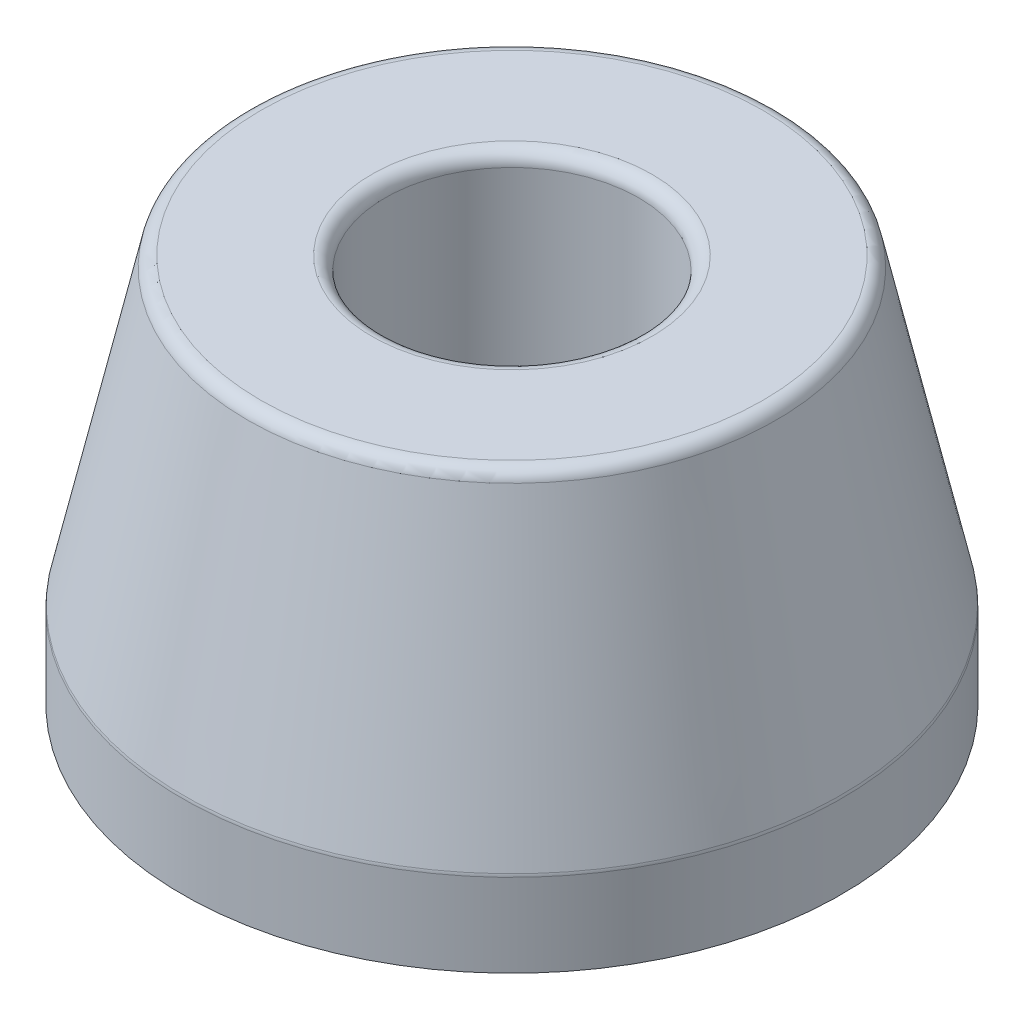
ISO-10303-21;
HEADER;
FILE_DESCRIPTION(('STEP AP214'),'2;1');
FILE_NAME('part.step','',(''),(''),'','','');
FILE_SCHEMA(('AUTOMOTIVE_DESIGN { 1 0 10303 214 1 1 1 1 }'));
ENDSEC;
DATA;
#1=APPLICATION_CONTEXT('core data for automotive mechanical design processes');
#2=APPLICATION_PROTOCOL_DEFINITION('international standard','automotive_design',2000,#1);
#3=PRODUCT_CONTEXT('',#1,'mechanical');
#4=PRODUCT('Part','Part','',(#3));
#5=PRODUCT_RELATED_PRODUCT_CATEGORY('part','',(#4));
#6=PRODUCT_DEFINITION_FORMATION('','',#4);
#7=PRODUCT_DEFINITION_CONTEXT('part definition',#1,'design');
#8=PRODUCT_DEFINITION('design','',#6,#7);
#9=PRODUCT_DEFINITION_SHAPE('','',#8);
#10=(LENGTH_UNIT() NAMED_UNIT(*) SI_UNIT(.MILLI.,.METRE.));
#11=(NAMED_UNIT(*) PLANE_ANGLE_UNIT() SI_UNIT($,.RADIAN.));
#12=(NAMED_UNIT(*) SI_UNIT($,.STERADIAN.) SOLID_ANGLE_UNIT());
#13=UNCERTAINTY_MEASURE_WITH_UNIT(LENGTH_MEASURE(1.E-05),#10,'distance_accuracy_value','');
#14=(GEOMETRIC_REPRESENTATION_CONTEXT(3) GLOBAL_UNCERTAINTY_ASSIGNED_CONTEXT((#13)) GLOBAL_UNIT_ASSIGNED_CONTEXT((#10,
#11,#12)) REPRESENTATION_CONTEXT('',''));
#15=CARTESIAN_POINT('',(0.,0.,0.));
#16=DIRECTION('',(0.,0.,1.));
#17=DIRECTION('',(1.,0.,0.));
#18=AXIS2_PLACEMENT_3D('',#15,#16,#17);
#19=CARTESIAN_POINT('',(12.3825,0.,0.));
#20=DIRECTION('',(0.,-1.,0.));
#21=DIRECTION('',(0.,0.,-1.));
#22=AXIS2_PLACEMENT_3D('',#19,#20,#21);
#23=PLANE('',#22);
#24=CARTESIAN_POINT('',(0.,0.,0.));
#25=DIRECTION('',(0.,-1.,0.));
#26=DIRECTION('',(0.,0.,-1.));
#27=AXIS2_PLACEMENT_3D('',#24,#25,#26);
#28=CIRCLE('',#27,12.3825);
#29=CARTESIAN_POINT('',(0.,0.,-12.3825));
#30=VERTEX_POINT('',#29);
#31=EDGE_CURVE('E61',#30,#30,#28,.T.);
#32=ORIENTED_EDGE('',*,*,#31,.T.);
#33=EDGE_LOOP('',(#32));
#34=FACE_BOUND('',#33,.T.);
#35=CARTESIAN_POINT('',(0.,0.,0.));
#36=DIRECTION('',(0.,-1.,0.));
#37=DIRECTION('',(0.,0.,-1.));
#38=AXIS2_PLACEMENT_3D('',#35,#36,#37);
#39=CIRCLE('',#38,4.7625);
#40=CARTESIAN_POINT('',(0.,0.,-4.7625));
#41=VERTEX_POINT('',#40);
#42=EDGE_CURVE('E10',#41,#41,#39,.T.);
#43=ORIENTED_EDGE('',*,*,#42,.F.);
#44=EDGE_LOOP('',(#43));
#45=FACE_BOUND('',#44,.T.);
#46=ADVANCED_FACE('F33',(#34,#45),#23,.T.);
#47=CARTESIAN_POINT('',(0.,0.,0.));
#48=DIRECTION('',(0.,-1.,0.));
#49=DIRECTION('',(0.,0.,-1.));
#50=AXIS2_PLACEMENT_3D('',#47,#48,#49);
#51=CYLINDRICAL_SURFACE('',#50,4.7625);
#52=ORIENTED_EDGE('',*,*,#42,.T.);
#53=EDGE_LOOP('',(#52));
#54=FACE_BOUND('',#53,.T.);
#55=CARTESIAN_POINT('',(0.,14.097,0.));
#56=DIRECTION('',(0.,-1.,0.));
#57=DIRECTION('',(0.,0.,-1.));
#58=AXIS2_PLACEMENT_3D('',#55,#56,#57);
#59=CIRCLE('',#58,4.7625);
#60=CARTESIAN_POINT('',(0.,14.097,-4.7625));
#61=VERTEX_POINT('',#60);
#62=EDGE_CURVE('E39',#61,#61,#59,.T.);
#63=ORIENTED_EDGE('',*,*,#62,.F.);
#64=EDGE_LOOP('',(#63));
#65=FACE_BOUND('',#64,.T.);
#66=ADVANCED_FACE('F79',(#54,#65),#51,.F.);
#67=CARTESIAN_POINT('',(0.,14.097,0.));
#68=DIRECTION('',(0.,-1.,0.));
#69=DIRECTION('',(0.,0.,-1.));
#70=AXIS2_PLACEMENT_3D('',#67,#68,#69);
#71=TOROIDAL_SURFACE('',#70,5.2705,0.508);
#72=ORIENTED_EDGE('',*,*,#62,.T.);
#73=EDGE_LOOP('',(#72));
#74=FACE_BOUND('',#73,.T.);
#75=CARTESIAN_POINT('',(0.,14.605,0.));
#76=DIRECTION('',(0.,-1.,0.));
#77=DIRECTION('',(0.,0.,-1.));
#78=AXIS2_PLACEMENT_3D('',#75,#76,#77);
#79=CIRCLE('',#78,5.2705);
#80=CARTESIAN_POINT('',(0.,14.605,-5.2705));
#81=VERTEX_POINT('',#80);
#82=EDGE_CURVE('E43',#81,#81,#79,.T.);
#83=ORIENTED_EDGE('',*,*,#82,.F.);
#84=EDGE_LOOP('',(#83));
#85=FACE_BOUND('',#84,.T.);
#86=ADVANCED_FACE('F83',(#74,#85),#71,.T.);
#87=CARTESIAN_POINT('',(5.2705,14.605,0.));
#88=DIRECTION('',(0.,1.,0.));
#89=DIRECTION('',(0.,0.,1.));
#90=AXIS2_PLACEMENT_3D('',#87,#88,#89);
#91=PLANE('',#90);
#92=ORIENTED_EDGE('',*,*,#82,.T.);
#93=EDGE_LOOP('',(#92));
#94=FACE_BOUND('',#93,.T.);
#95=CARTESIAN_POINT('',(0.,14.605,0.));
#96=DIRECTION('',(0.,-1.,0.));
#97=DIRECTION('',(0.,0.,-1.));
#98=AXIS2_PLACEMENT_3D('',#95,#96,#97);
#99=CIRCLE('',#98,9.43499682396613);
#100=CARTESIAN_POINT('',(0.,14.605,-9.43499682396613));
#101=VERTEX_POINT('',#100);
#102=EDGE_CURVE('E47',#101,#101,#99,.T.);
#103=ORIENTED_EDGE('',*,*,#102,.F.);
#104=EDGE_LOOP('',(#103));
#105=FACE_BOUND('',#104,.T.);
#106=ADVANCED_FACE('F87',(#94,#105),#91,.T.);
#107=CARTESIAN_POINT('',(0.,14.097,0.));
#108=DIRECTION('',(0.,-1.,0.));
#109=DIRECTION('',(0.,0.,-1.));
#110=AXIS2_PLACEMENT_3D('',#107,#108,#109);
#111=TOROIDAL_SURFACE('',#110,9.43499682396614,0.507999999999999);
#112=ORIENTED_EDGE('',*,*,#102,.T.);
#113=EDGE_LOOP('',(#112));
#114=FACE_BOUND('',#113,.T.);
#115=CARTESIAN_POINT('',(0.,14.2072006725719,0.));
#116=DIRECTION('',(0.,-1.,0.));
#117=DIRECTION('',(0.,0.,-1.));
#118=AXIS2_PLACEMENT_3D('',#115,#116,#117);
#119=CIRCLE('',#118,9.93089985053958);
#120=CARTESIAN_POINT('',(0.,14.2072006725719,-9.93089985053958));
#121=VERTEX_POINT('',#120);
#122=EDGE_CURVE('E52',#121,#121,#119,.T.);
#123=ORIENTED_EDGE('',*,*,#122,.F.);
#124=EDGE_LOOP('',(#123));
#125=FACE_BOUND('',#124,.T.);
#126=ADVANCED_FACE('F93',(#114,#125),#111,.T.);
#127=CARTESIAN_POINT('',(0.,3.22943638041949,0.));
#128=DIRECTION('',(0.,-1.,0.));
#129=DIRECTION('',(0.,0.,-1.));
#130=AXIS2_PLACEMENT_3D('',#127,#128,#129);
#131=CONICAL_SURFACE('',#130,12.3704030265734,0.218668945873942);
#132=ORIENTED_EDGE('',*,*,#122,.T.);
#133=EDGE_LOOP('',(#132));
#134=FACE_BOUND('',#133,.T.);
#135=CARTESIAN_POINT('',(0.,3.22943638041949,0.));
#136=DIRECTION('',(0.,-1.,0.));
#137=DIRECTION('',(0.,0.,-1.));
#138=AXIS2_PLACEMENT_3D('',#135,#136,#137);
#139=CIRCLE('',#138,12.3704030265734);
#140=CARTESIAN_POINT('',(0.,3.22943638041949,-12.3704030265734));
#141=VERTEX_POINT('',#140);
#142=EDGE_CURVE('E55',#141,#141,#139,.T.);
#143=ORIENTED_EDGE('',*,*,#142,.F.);
#144=EDGE_LOOP('',(#143));
#145=FACE_BOUND('',#144,.T.);
#146=ADVANCED_FACE('F75',(#134,#145),#131,.T.);
#147=CARTESIAN_POINT('',(0.,3.11923570784761,0.));
#148=DIRECTION('',(0.,-1.,0.));
#149=DIRECTION('',(0.,0.,-1.));
#150=AXIS2_PLACEMENT_3D('',#147,#148,#149);
#151=TOROIDAL_SURFACE('',#150,11.8745,0.508);
#152=ORIENTED_EDGE('',*,*,#142,.T.);
#153=EDGE_LOOP('',(#152));
#154=FACE_BOUND('',#153,.T.);
#155=CARTESIAN_POINT('',(0.,3.11923570784761,0.));
#156=DIRECTION('',(0.,-1.,0.));
#157=DIRECTION('',(0.,0.,-1.));
#158=AXIS2_PLACEMENT_3D('',#155,#156,#157);
#159=CIRCLE('',#158,12.3825);
#160=CARTESIAN_POINT('',(0.,3.11923570784761,-12.3825));
#161=VERTEX_POINT('',#160);
#162=EDGE_CURVE('E58',#161,#161,#159,.T.);
#163=ORIENTED_EDGE('',*,*,#162,.F.);
#164=EDGE_LOOP('',(#163));
#165=FACE_BOUND('',#164,.T.);
#166=ADVANCED_FACE('F69',(#154,#165),#151,.T.);
#167=CARTESIAN_POINT('',(0.,0.,0.));
#168=DIRECTION('',(0.,-1.,0.));
#169=DIRECTION('',(0.,0.,-1.));
#170=AXIS2_PLACEMENT_3D('',#167,#168,#169);
#171=CYLINDRICAL_SURFACE('',#170,12.3825);
#172=ORIENTED_EDGE('',*,*,#162,.T.);
#173=EDGE_LOOP('',(#172));
#174=FACE_BOUND('',#173,.T.);
#175=ORIENTED_EDGE('',*,*,#31,.F.);
#176=EDGE_LOOP('',(#175));
#177=FACE_BOUND('',#176,.T.);
#178=ADVANCED_FACE('F67',(#174,#177),#171,.T.);
#179=CLOSED_SHELL('',(#46,#66,#86,#106,#126,#146,#166,#178));
#180=MANIFOLD_SOLID_BREP('B2',#179);
#181=ADVANCED_BREP_SHAPE_REPRESENTATION('',(#18,#180),#14);
#182=SHAPE_DEFINITION_REPRESENTATION(#9,#181);
ENDSEC;
END-ISO-10303-21;
